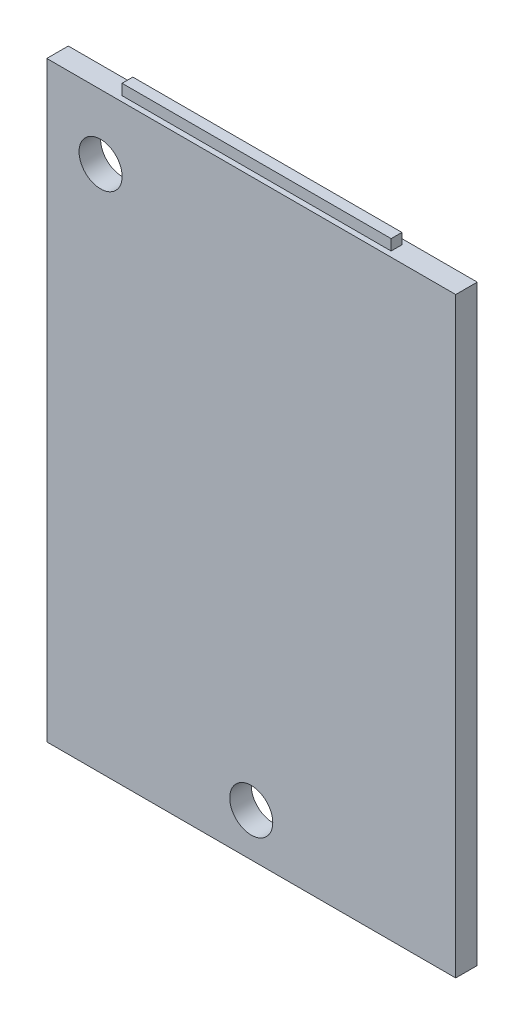
ISO-10303-21;
HEADER;
FILE_DESCRIPTION(('STEP AP214'),'2;1');
FILE_NAME('part.step','',(''),(''),'','','');
FILE_SCHEMA(('AUTOMOTIVE_DESIGN { 1 0 10303 214 1 1 1 1 }'));
ENDSEC;
DATA;
#1=APPLICATION_CONTEXT('core data for automotive mechanical design processes');
#2=APPLICATION_PROTOCOL_DEFINITION('international standard','automotive_design',2000,#1);
#3=PRODUCT_CONTEXT('',#1,'mechanical');
#4=PRODUCT('Part','Part','',(#3));
#5=PRODUCT_RELATED_PRODUCT_CATEGORY('part','',(#4));
#6=PRODUCT_DEFINITION_FORMATION('','',#4);
#7=PRODUCT_DEFINITION_CONTEXT('part definition',#1,'design');
#8=PRODUCT_DEFINITION('design','',#6,#7);
#9=PRODUCT_DEFINITION_SHAPE('','',#8);
#10=(LENGTH_UNIT() NAMED_UNIT(*) SI_UNIT(.MILLI.,.METRE.));
#11=(NAMED_UNIT(*) PLANE_ANGLE_UNIT() SI_UNIT($,.RADIAN.));
#12=(NAMED_UNIT(*) SI_UNIT($,.STERADIAN.) SOLID_ANGLE_UNIT());
#13=UNCERTAINTY_MEASURE_WITH_UNIT(LENGTH_MEASURE(1.E-05),#10,'distance_accuracy_value','');
#14=(GEOMETRIC_REPRESENTATION_CONTEXT(3) GLOBAL_UNCERTAINTY_ASSIGNED_CONTEXT((#13)) GLOBAL_UNIT_ASSIGNED_CONTEXT((#10,
#11,#12)) REPRESENTATION_CONTEXT('',''));
#15=CARTESIAN_POINT('',(0.,0.,0.));
#16=DIRECTION('',(0.,0.,1.));
#17=DIRECTION('',(1.,0.,0.));
#18=AXIS2_PLACEMENT_3D('',#15,#16,#17);
#19=CARTESIAN_POINT('',(95.,137.5,10.));
#20=DIRECTION('',(0.,-1.,0.));
#21=DIRECTION('',(1.,0.,0.));
#22=AXIS2_PLACEMENT_3D('',#19,#20,#21);
#23=PLANE('',#22);
#24=DIRECTION('',(-1.,0.,0.));
#25=VECTOR('',#24,1.);
#26=CARTESIAN_POINT('',(95.,137.5,0.));
#27=LINE('',#26,#25);
#28=CARTESIAN_POINT('',(95.,137.5,0.));
#29=VERTEX_POINT('',#28);
#30=CARTESIAN_POINT('',(-95.,137.5,0.));
#31=VERTEX_POINT('',#30);
#32=EDGE_CURVE('E143',#29,#31,#27,.T.);
#33=ORIENTED_EDGE('',*,*,#32,.T.);
#34=DIRECTION('',(0.,0.,-1.));
#35=VECTOR('',#34,1.);
#36=CARTESIAN_POINT('',(-95.,137.5,10.));
#37=LINE('',#36,#35);
#38=CARTESIAN_POINT('',(-95.,137.5,10.));
#39=VERTEX_POINT('',#38);
#40=EDGE_CURVE('E148',#39,#31,#37,.T.);
#41=ORIENTED_EDGE('',*,*,#40,.F.);
#42=DIRECTION('',(-1.,0.,0.));
#43=VECTOR('',#42,1.);
#44=CARTESIAN_POINT('',(95.,137.5,10.));
#45=LINE('',#44,#43);
#46=CARTESIAN_POINT('',(95.,137.5,10.));
#47=VERTEX_POINT('',#46);
#48=EDGE_CURVE('E147',#47,#39,#45,.T.);
#49=ORIENTED_EDGE('',*,*,#48,.F.);
#50=DIRECTION('',(0.,0.,-1.));
#51=VECTOR('',#50,1.);
#52=CARTESIAN_POINT('',(95.,137.5,10.));
#53=LINE('',#52,#51);
#54=EDGE_CURVE('E156',#47,#29,#53,.T.);
#55=ORIENTED_EDGE('',*,*,#54,.T.);
#56=EDGE_LOOP('',(#33,#41,#49,#55));
#57=FACE_BOUND('',#56,.T.);
#58=DIRECTION('',(0.,0.,1.));
#59=VECTOR('',#58,1.);
#60=CARTESIAN_POINT('',(-62.5,137.5,7.50000000000002));
#61=LINE('',#60,#59);
#62=CARTESIAN_POINT('',(-62.5,137.5,2.50000000000002));
#63=VERTEX_POINT('',#62);
#64=CARTESIAN_POINT('',(-62.5,137.5,7.50000000000002));
#65=VERTEX_POINT('',#64);
#66=EDGE_CURVE('E60',#63,#65,#61,.T.);
#67=ORIENTED_EDGE('',*,*,#66,.F.);
#68=DIRECTION('',(-1.,0.,0.));
#69=VECTOR('',#68,1.);
#70=CARTESIAN_POINT('',(62.5,137.5,2.50000000000001));
#71=LINE('',#70,#69);
#72=CARTESIAN_POINT('',(62.5,137.5,2.50000000000001));
#73=VERTEX_POINT('',#72);
#74=EDGE_CURVE('E64',#73,#63,#71,.T.);
#75=ORIENTED_EDGE('',*,*,#74,.F.);
#76=DIRECTION('',(0.,0.,-1.));
#77=VECTOR('',#76,1.);
#78=CARTESIAN_POINT('',(62.5,137.5,7.50000000000001));
#79=LINE('',#78,#77);
#80=CARTESIAN_POINT('',(62.5,137.5,7.50000000000001));
#81=VERTEX_POINT('',#80);
#82=EDGE_CURVE('E180',#81,#73,#79,.T.);
#83=ORIENTED_EDGE('',*,*,#82,.F.);
#84=DIRECTION('',(1.,0.,0.));
#85=VECTOR('',#84,1.);
#86=CARTESIAN_POINT('',(62.5,137.5,7.50000000000001));
#87=LINE('',#86,#85);
#88=EDGE_CURVE('E178',#65,#81,#87,.T.);
#89=ORIENTED_EDGE('',*,*,#88,.F.);
#90=EDGE_LOOP('',(#67,#75,#83,#89));
#91=FACE_BOUND('',#90,.T.);
#92=ADVANCED_FACE('F43',(#57,#91),#23,.F.);
#93=CARTESIAN_POINT('',(-95.,-137.5,10.));
#94=DIRECTION('',(1.,0.,0.));
#95=DIRECTION('',(0.,0.,-1.));
#96=AXIS2_PLACEMENT_3D('',#93,#94,#95);
#97=PLANE('',#96);
#98=DIRECTION('',(0.,-1.,0.));
#99=VECTOR('',#98,1.);
#100=CARTESIAN_POINT('',(-95.,-137.5,0.));
#101=LINE('',#100,#99);
#102=CARTESIAN_POINT('',(-95.,-137.5,0.));
#103=VERTEX_POINT('',#102);
#104=EDGE_CURVE('E130',#31,#103,#101,.T.);
#105=ORIENTED_EDGE('',*,*,#104,.T.);
#106=DIRECTION('',(0.,0.,-1.));
#107=VECTOR('',#106,1.);
#108=CARTESIAN_POINT('',(-95.,-137.5,10.));
#109=LINE('',#108,#107);
#110=CARTESIAN_POINT('',(-95.,-137.5,10.));
#111=VERTEX_POINT('',#110);
#112=EDGE_CURVE('E11',#111,#103,#109,.T.);
#113=ORIENTED_EDGE('',*,*,#112,.F.);
#114=DIRECTION('',(0.,-1.,0.));
#115=VECTOR('',#114,1.);
#116=CARTESIAN_POINT('',(-95.,-137.5,10.));
#117=LINE('',#116,#115);
#118=EDGE_CURVE('E139',#39,#111,#117,.T.);
#119=ORIENTED_EDGE('',*,*,#118,.F.);
#120=ORIENTED_EDGE('',*,*,#40,.T.);
#121=EDGE_LOOP('',(#105,#113,#119,#120));
#122=FACE_BOUND('',#121,.T.);
#123=ADVANCED_FACE('F45',(#122),#97,.F.);
#124=CARTESIAN_POINT('',(95.,-137.5,10.));
#125=DIRECTION('',(0.,1.,0.));
#126=DIRECTION('',(-1.,0.,0.));
#127=AXIS2_PLACEMENT_3D('',#124,#125,#126);
#128=PLANE('',#127);
#129=DIRECTION('',(1.,0.,0.));
#130=VECTOR('',#129,1.);
#131=CARTESIAN_POINT('',(95.,-137.5,0.));
#132=LINE('',#131,#130);
#133=CARTESIAN_POINT('',(95.,-137.5,0.));
#134=VERTEX_POINT('',#133);
#135=EDGE_CURVE('E133',#103,#134,#132,.T.);
#136=ORIENTED_EDGE('',*,*,#135,.T.);
#137=DIRECTION('',(0.,0.,-1.));
#138=VECTOR('',#137,1.);
#139=CARTESIAN_POINT('',(95.,-137.5,10.));
#140=LINE('',#139,#138);
#141=CARTESIAN_POINT('',(95.,-137.5,10.));
#142=VERTEX_POINT('',#141);
#143=EDGE_CURVE('E52',#142,#134,#140,.T.);
#144=ORIENTED_EDGE('',*,*,#143,.F.);
#145=DIRECTION('',(1.,0.,0.));
#146=VECTOR('',#145,1.);
#147=CARTESIAN_POINT('',(95.,-137.5,10.));
#148=LINE('',#147,#146);
#149=EDGE_CURVE('E142',#111,#142,#148,.T.);
#150=ORIENTED_EDGE('',*,*,#149,.F.);
#151=ORIENTED_EDGE('',*,*,#112,.T.);
#152=EDGE_LOOP('',(#136,#144,#150,#151));
#153=FACE_BOUND('',#152,.T.);
#154=ADVANCED_FACE('F197',(#153),#128,.F.);
#155=CARTESIAN_POINT('',(95.,-137.5,10.));
#156=DIRECTION('',(-1.,0.,0.));
#157=DIRECTION('',(0.,0.,1.));
#158=AXIS2_PLACEMENT_3D('',#155,#156,#157);
#159=PLANE('',#158);
#160=DIRECTION('',(0.,1.,0.));
#161=VECTOR('',#160,1.);
#162=CARTESIAN_POINT('',(95.,-137.5,0.));
#163=LINE('',#162,#161);
#164=EDGE_CURVE('E151',#134,#29,#163,.T.);
#165=ORIENTED_EDGE('',*,*,#164,.T.);
#166=ORIENTED_EDGE('',*,*,#54,.F.);
#167=DIRECTION('',(0.,1.,0.));
#168=VECTOR('',#167,1.);
#169=CARTESIAN_POINT('',(95.,-137.5,10.));
#170=LINE('',#169,#168);
#171=EDGE_CURVE('E145',#142,#47,#170,.T.);
#172=ORIENTED_EDGE('',*,*,#171,.F.);
#173=ORIENTED_EDGE('',*,*,#143,.T.);
#174=EDGE_LOOP('',(#165,#166,#172,#173));
#175=FACE_BOUND('',#174,.T.);
#176=ADVANCED_FACE('F203',(#175),#159,.F.);
#177=CARTESIAN_POINT('',(0.,0.,10.));
#178=DIRECTION('',(0.,0.,1.));
#179=DIRECTION('',(1.,0.,0.));
#180=AXIS2_PLACEMENT_3D('',#177,#178,#179);
#181=PLANE('',#180);
#182=CARTESIAN_POINT('',(0.,-117.5,10.));
#183=DIRECTION('',(0.,0.,1.));
#184=DIRECTION('',(1.,0.,0.));
#185=AXIS2_PLACEMENT_3D('',#182,#183,#184);
#186=CIRCLE('',#185,10.);
#187=CARTESIAN_POINT('',(10.,-117.5,10.));
#188=VERTEX_POINT('',#187);
#189=EDGE_CURVE('E162',#188,#188,#186,.T.);
#190=ORIENTED_EDGE('',*,*,#189,.F.);
#191=EDGE_LOOP('',(#190));
#192=FACE_BOUND('',#191,.T.);
#193=CARTESIAN_POINT('',(-70.,107.5,10.));
#194=DIRECTION('',(0.,0.,1.));
#195=DIRECTION('',(1.,0.,0.));
#196=AXIS2_PLACEMENT_3D('',#193,#194,#195);
#197=CIRCLE('',#196,9.99999999999999);
#198=CARTESIAN_POINT('',(-60.,107.5,10.));
#199=VERTEX_POINT('',#198);
#200=EDGE_CURVE('E167',#199,#199,#197,.T.);
#201=ORIENTED_EDGE('',*,*,#200,.F.);
#202=EDGE_LOOP('',(#201));
#203=FACE_BOUND('',#202,.T.);
#204=ORIENTED_EDGE('',*,*,#118,.T.);
#205=ORIENTED_EDGE('',*,*,#149,.T.);
#206=ORIENTED_EDGE('',*,*,#171,.T.);
#207=ORIENTED_EDGE('',*,*,#48,.T.);
#208=EDGE_LOOP('',(#204,#205,#206,#207));
#209=FACE_BOUND('',#208,.T.);
#210=ADVANCED_FACE('F204',(#192,#203,#209),#181,.T.);
#211=CARTESIAN_POINT('',(0.,0.,0.));
#212=DIRECTION('',(0.,0.,1.));
#213=DIRECTION('',(1.,0.,0.));
#214=AXIS2_PLACEMENT_3D('',#211,#212,#213);
#215=PLANE('',#214);
#216=CARTESIAN_POINT('',(0.,-117.5,0.));
#217=DIRECTION('',(0.,0.,1.));
#218=DIRECTION('',(1.,0.,0.));
#219=AXIS2_PLACEMENT_3D('',#216,#217,#218);
#220=CIRCLE('',#219,10.);
#221=CARTESIAN_POINT('',(10.,-117.5,0.));
#222=VERTEX_POINT('',#221);
#223=EDGE_CURVE('E47',#222,#222,#220,.T.);
#224=ORIENTED_EDGE('',*,*,#223,.T.);
#225=EDGE_LOOP('',(#224));
#226=FACE_BOUND('',#225,.T.);
#227=CARTESIAN_POINT('',(-70.,107.5,0.));
#228=DIRECTION('',(0.,0.,1.));
#229=DIRECTION('',(1.,0.,0.));
#230=AXIS2_PLACEMENT_3D('',#227,#228,#229);
#231=CIRCLE('',#230,9.99999999999999);
#232=CARTESIAN_POINT('',(-60.,107.5,0.));
#233=VERTEX_POINT('',#232);
#234=EDGE_CURVE('E160',#233,#233,#231,.T.);
#235=ORIENTED_EDGE('',*,*,#234,.T.);
#236=EDGE_LOOP('',(#235));
#237=FACE_BOUND('',#236,.T.);
#238=ORIENTED_EDGE('',*,*,#104,.F.);
#239=ORIENTED_EDGE('',*,*,#32,.F.);
#240=ORIENTED_EDGE('',*,*,#164,.F.);
#241=ORIENTED_EDGE('',*,*,#135,.F.);
#242=EDGE_LOOP('',(#238,#239,#240,#241));
#243=FACE_BOUND('',#242,.T.);
#244=ADVANCED_FACE('F201',(#226,#237,#243),#215,.F.);
#245=CARTESIAN_POINT('',(-62.5,142.5,7.50000000000002));
#246=DIRECTION('',(1.,0.,0.));
#247=DIRECTION('',(0.,0.,-1.));
#248=AXIS2_PLACEMENT_3D('',#245,#246,#247);
#249=PLANE('',#248);
#250=ORIENTED_EDGE('',*,*,#66,.T.);
#251=DIRECTION('',(0.,-1.,0.));
#252=VECTOR('',#251,1.);
#253=CARTESIAN_POINT('',(-62.5,142.5,7.50000000000002));
#254=LINE('',#253,#252);
#255=CARTESIAN_POINT('',(-62.5,142.5,7.50000000000002));
#256=VERTEX_POINT('',#255);
#257=EDGE_CURVE('E113',#256,#65,#254,.T.);
#258=ORIENTED_EDGE('',*,*,#257,.F.);
#259=DIRECTION('',(0.,0.,1.));
#260=VECTOR('',#259,1.);
#261=CARTESIAN_POINT('',(-62.5,142.5,7.50000000000002));
#262=LINE('',#261,#260);
#263=CARTESIAN_POINT('',(-62.5,142.5,2.50000000000002));
#264=VERTEX_POINT('',#263);
#265=EDGE_CURVE('E119',#264,#256,#262,.T.);
#266=ORIENTED_EDGE('',*,*,#265,.F.);
#267=DIRECTION('',(0.,-1.,0.));
#268=VECTOR('',#267,1.);
#269=CARTESIAN_POINT('',(-62.5,142.5,2.50000000000002));
#270=LINE('',#269,#268);
#271=EDGE_CURVE('E176',#264,#63,#270,.T.);
#272=ORIENTED_EDGE('',*,*,#271,.T.);
#273=EDGE_LOOP('',(#250,#258,#266,#272));
#274=FACE_BOUND('',#273,.T.);
#275=ADVANCED_FACE('F129',(#274),#249,.F.);
#276=CARTESIAN_POINT('',(62.5,142.5,7.50000000000001));
#277=DIRECTION('',(0.,0.,-1.));
#278=DIRECTION('',(-1.,0.,0.));
#279=AXIS2_PLACEMENT_3D('',#276,#277,#278);
#280=PLANE('',#279);
#281=ORIENTED_EDGE('',*,*,#88,.T.);
#282=DIRECTION('',(0.,-1.,0.));
#283=VECTOR('',#282,1.);
#284=CARTESIAN_POINT('',(62.5,142.5,7.50000000000001));
#285=LINE('',#284,#283);
#286=CARTESIAN_POINT('',(62.5,142.5,7.50000000000001));
#287=VERTEX_POINT('',#286);
#288=EDGE_CURVE('E115',#287,#81,#285,.T.);
#289=ORIENTED_EDGE('',*,*,#288,.F.);
#290=DIRECTION('',(1.,0.,0.));
#291=VECTOR('',#290,1.);
#292=CARTESIAN_POINT('',(62.5,142.5,7.50000000000001));
#293=LINE('',#292,#291);
#294=EDGE_CURVE('E108',#256,#287,#293,.T.);
#295=ORIENTED_EDGE('',*,*,#294,.F.);
#296=ORIENTED_EDGE('',*,*,#257,.T.);
#297=EDGE_LOOP('',(#281,#289,#295,#296));
#298=FACE_BOUND('',#297,.T.);
#299=ADVANCED_FACE('F111',(#298),#280,.F.);
#300=CARTESIAN_POINT('',(62.5,142.5,7.50000000000001));
#301=DIRECTION('',(-1.,0.,0.));
#302=DIRECTION('',(0.,0.,1.));
#303=AXIS2_PLACEMENT_3D('',#300,#301,#302);
#304=PLANE('',#303);
#305=ORIENTED_EDGE('',*,*,#82,.T.);
#306=DIRECTION('',(0.,-1.,0.));
#307=VECTOR('',#306,1.);
#308=CARTESIAN_POINT('',(62.5,142.5,2.50000000000001));
#309=LINE('',#308,#307);
#310=CARTESIAN_POINT('',(62.5,142.5,2.50000000000001));
#311=VERTEX_POINT('',#310);
#312=EDGE_CURVE('E135',#311,#73,#309,.T.);
#313=ORIENTED_EDGE('',*,*,#312,.F.);
#314=DIRECTION('',(0.,0.,-1.));
#315=VECTOR('',#314,1.);
#316=CARTESIAN_POINT('',(62.5,142.5,7.50000000000001));
#317=LINE('',#316,#315);
#318=EDGE_CURVE('E118',#287,#311,#317,.T.);
#319=ORIENTED_EDGE('',*,*,#318,.F.);
#320=ORIENTED_EDGE('',*,*,#288,.T.);
#321=EDGE_LOOP('',(#305,#313,#319,#320));
#322=FACE_BOUND('',#321,.T.);
#323=ADVANCED_FACE('F188',(#322),#304,.F.);
#324=CARTESIAN_POINT('',(62.5,142.5,2.50000000000001));
#325=DIRECTION('',(0.,0.,1.));
#326=DIRECTION('',(1.,0.,0.));
#327=AXIS2_PLACEMENT_3D('',#324,#325,#326);
#328=PLANE('',#327);
#329=ORIENTED_EDGE('',*,*,#74,.T.);
#330=ORIENTED_EDGE('',*,*,#271,.F.);
#331=DIRECTION('',(-1.,0.,0.));
#332=VECTOR('',#331,1.);
#333=CARTESIAN_POINT('',(62.5,142.5,2.50000000000001));
#334=LINE('',#333,#332);
#335=EDGE_CURVE('E124',#311,#264,#334,.T.);
#336=ORIENTED_EDGE('',*,*,#335,.F.);
#337=ORIENTED_EDGE('',*,*,#312,.T.);
#338=EDGE_LOOP('',(#329,#330,#336,#337));
#339=FACE_BOUND('',#338,.T.);
#340=ADVANCED_FACE('F186',(#339),#328,.F.);
#341=CARTESIAN_POINT('',(0.,142.5,0.));
#342=DIRECTION('',(0.,1.,0.));
#343=DIRECTION('',(0.,0.,1.));
#344=AXIS2_PLACEMENT_3D('',#341,#342,#343);
#345=PLANE('',#344);
#346=ORIENTED_EDGE('',*,*,#265,.T.);
#347=ORIENTED_EDGE('',*,*,#294,.T.);
#348=ORIENTED_EDGE('',*,*,#318,.T.);
#349=ORIENTED_EDGE('',*,*,#335,.T.);
#350=EDGE_LOOP('',(#346,#347,#348,#349));
#351=FACE_BOUND('',#350,.T.);
#352=ADVANCED_FACE('F122',(#351),#345,.T.);
#353=CARTESIAN_POINT('',(-70.,107.5,-6.));
#354=DIRECTION('',(0.,0.,1.));
#355=DIRECTION('',(1.,0.,0.));
#356=AXIS2_PLACEMENT_3D('',#353,#354,#355);
#357=CYLINDRICAL_SURFACE('',#356,9.99999999999999);
#358=ORIENTED_EDGE('',*,*,#200,.T.);
#359=EDGE_LOOP('',(#358));
#360=FACE_BOUND('',#359,.T.);
#361=ORIENTED_EDGE('',*,*,#234,.F.);
#362=EDGE_LOOP('',(#361));
#363=FACE_BOUND('',#362,.T.);
#364=ADVANCED_FACE('F239',(#360,#363),#357,.F.);
#365=CARTESIAN_POINT('',(0.,-117.5,-6.));
#366=DIRECTION('',(0.,0.,1.));
#367=DIRECTION('',(1.,0.,0.));
#368=AXIS2_PLACEMENT_3D('',#365,#366,#367);
#369=CYLINDRICAL_SURFACE('',#368,10.);
#370=ORIENTED_EDGE('',*,*,#189,.T.);
#371=EDGE_LOOP('',(#370));
#372=FACE_BOUND('',#371,.T.);
#373=ORIENTED_EDGE('',*,*,#223,.F.);
#374=EDGE_LOOP('',(#373));
#375=FACE_BOUND('',#374,.T.);
#376=ADVANCED_FACE('F242',(#372,#375),#369,.F.);
#377=CLOSED_SHELL('',(#92,#123,#154,#176,#210,#244,#275,#299,#323,#340,#352,#364,#376));
#378=MANIFOLD_SOLID_BREP('B2',#377);
#379=ADVANCED_BREP_SHAPE_REPRESENTATION('',(#18,#378),#14);
#380=SHAPE_DEFINITION_REPRESENTATION(#9,#379);
ENDSEC;
END-ISO-10303-21;
